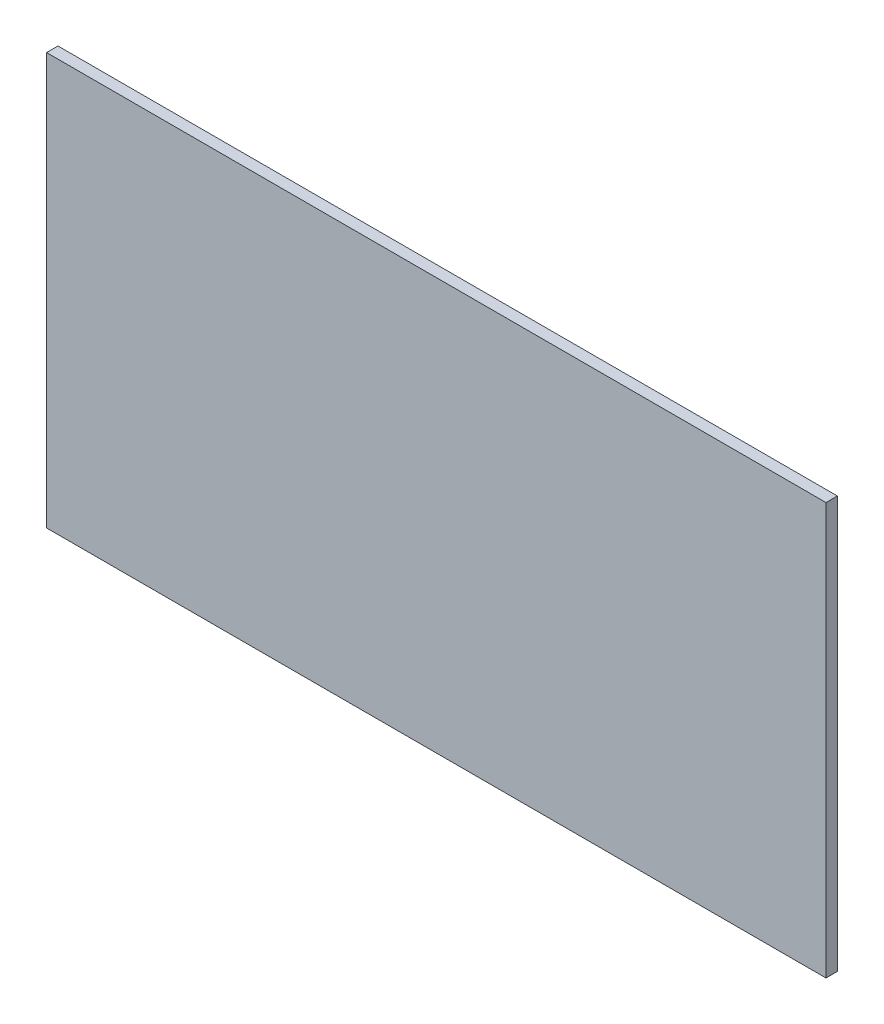
ISO-10303-21;
HEADER;
FILE_DESCRIPTION(('STEP AP214'),'2;1');
FILE_NAME('part.step','',(''),(''),'','','');
FILE_SCHEMA(('AUTOMOTIVE_DESIGN { 1 0 10303 214 1 1 1 1 }'));
ENDSEC;
DATA;
#1=APPLICATION_CONTEXT('core data for automotive mechanical design processes');
#2=APPLICATION_PROTOCOL_DEFINITION('international standard','automotive_design',2000,#1);
#3=PRODUCT_CONTEXT('',#1,'mechanical');
#4=PRODUCT('Part','Part','',(#3));
#5=PRODUCT_RELATED_PRODUCT_CATEGORY('part','',(#4));
#6=PRODUCT_DEFINITION_FORMATION('','',#4);
#7=PRODUCT_DEFINITION_CONTEXT('part definition',#1,'design');
#8=PRODUCT_DEFINITION('design','',#6,#7);
#9=PRODUCT_DEFINITION_SHAPE('','',#8);
#10=(LENGTH_UNIT() NAMED_UNIT(*) SI_UNIT(.MILLI.,.METRE.));
#11=(NAMED_UNIT(*) PLANE_ANGLE_UNIT() SI_UNIT($,.RADIAN.));
#12=(NAMED_UNIT(*) SI_UNIT($,.STERADIAN.) SOLID_ANGLE_UNIT());
#13=UNCERTAINTY_MEASURE_WITH_UNIT(LENGTH_MEASURE(1.E-05),#10,'distance_accuracy_value','');
#14=(GEOMETRIC_REPRESENTATION_CONTEXT(3) GLOBAL_UNCERTAINTY_ASSIGNED_CONTEXT((#13)) GLOBAL_UNIT_ASSIGNED_CONTEXT((#10,
#11,#12)) REPRESENTATION_CONTEXT('',''));
#15=CARTESIAN_POINT('',(0.,0.,0.));
#16=DIRECTION('',(0.,0.,1.));
#17=DIRECTION('',(1.,0.,0.));
#18=AXIS2_PLACEMENT_3D('',#15,#16,#17);
#19=CARTESIAN_POINT('',(0.,0.,1.55));
#20=DIRECTION('',(1.,0.,0.));
#21=DIRECTION('',(0.,0.,-1.));
#22=AXIS2_PLACEMENT_3D('',#19,#20,#21);
#23=PLANE('',#22);
#24=DIRECTION('',(0.,-1.,0.));
#25=VECTOR('',#24,1.);
#26=CARTESIAN_POINT('',(0.,0.,0.));
#27=LINE('',#26,#25);
#28=CARTESIAN_POINT('',(0.,56.,0.));
#29=VERTEX_POINT('',#28);
#30=CARTESIAN_POINT('',(0.,0.,0.));
#31=VERTEX_POINT('',#30);
#32=EDGE_CURVE('E95',#29,#31,#27,.T.);
#33=ORIENTED_EDGE('',*,*,#32,.T.);
#34=DIRECTION('',(0.,0.,-1.));
#35=VECTOR('',#34,1.);
#36=CARTESIAN_POINT('',(0.,0.,1.55));
#37=LINE('',#36,#35);
#38=CARTESIAN_POINT('',(0.,0.,1.55));
#39=VERTEX_POINT('',#38);
#40=EDGE_CURVE('E11',#39,#31,#37,.T.);
#41=ORIENTED_EDGE('',*,*,#40,.F.);
#42=DIRECTION('',(0.,-1.,0.));
#43=VECTOR('',#42,1.);
#44=CARTESIAN_POINT('',(0.,0.,1.55));
#45=LINE('',#44,#43);
#46=CARTESIAN_POINT('',(0.,56.,1.55));
#47=VERTEX_POINT('',#46);
#48=EDGE_CURVE('E83',#47,#39,#45,.T.);
#49=ORIENTED_EDGE('',*,*,#48,.F.);
#50=DIRECTION('',(0.,0.,-1.));
#51=VECTOR('',#50,1.);
#52=CARTESIAN_POINT('',(0.,56.,1.55));
#53=LINE('',#52,#51);
#54=EDGE_CURVE('E91',#47,#29,#53,.T.);
#55=ORIENTED_EDGE('',*,*,#54,.T.);
#56=EDGE_LOOP('',(#33,#41,#49,#55));
#57=FACE_BOUND('',#56,.T.);
#58=ADVANCED_FACE('F32',(#57),#23,.F.);
#59=CARTESIAN_POINT('',(0.,0.,1.55));
#60=DIRECTION('',(0.,1.,0.));
#61=DIRECTION('',(0.,0.,1.));
#62=AXIS2_PLACEMENT_3D('',#59,#60,#61);
#63=PLANE('',#62);
#64=DIRECTION('',(1.,0.,0.));
#65=VECTOR('',#64,1.);
#66=CARTESIAN_POINT('',(0.,0.,0.));
#67=LINE('',#66,#65);
#68=CARTESIAN_POINT('',(106.,0.,0.));
#69=VERTEX_POINT('',#68);
#70=EDGE_CURVE('E87',#31,#69,#67,.T.);
#71=ORIENTED_EDGE('',*,*,#70,.T.);
#72=DIRECTION('',(0.,0.,-1.));
#73=VECTOR('',#72,1.);
#74=CARTESIAN_POINT('',(106.,0.,1.55));
#75=LINE('',#74,#73);
#76=CARTESIAN_POINT('',(106.,0.,1.55));
#77=VERTEX_POINT('',#76);
#78=EDGE_CURVE('E40',#77,#69,#75,.T.);
#79=ORIENTED_EDGE('',*,*,#78,.F.);
#80=DIRECTION('',(1.,0.,0.));
#81=VECTOR('',#80,1.);
#82=CARTESIAN_POINT('',(0.,0.,1.55));
#83=LINE('',#82,#81);
#84=EDGE_CURVE('E78',#39,#77,#83,.T.);
#85=ORIENTED_EDGE('',*,*,#84,.F.);
#86=ORIENTED_EDGE('',*,*,#40,.T.);
#87=EDGE_LOOP('',(#71,#79,#85,#86));
#88=FACE_BOUND('',#87,.T.);
#89=ADVANCED_FACE('F86',(#88),#63,.F.);
#90=CARTESIAN_POINT('',(106.,0.,1.55));
#91=DIRECTION('',(-1.,0.,0.));
#92=DIRECTION('',(0.,0.,1.));
#93=AXIS2_PLACEMENT_3D('',#90,#91,#92);
#94=PLANE('',#93);
#95=DIRECTION('',(0.,1.,0.));
#96=VECTOR('',#95,1.);
#97=CARTESIAN_POINT('',(106.,0.,0.));
#98=LINE('',#97,#96);
#99=CARTESIAN_POINT('',(106.,56.,0.));
#100=VERTEX_POINT('',#99);
#101=EDGE_CURVE('E65',#69,#100,#98,.T.);
#102=ORIENTED_EDGE('',*,*,#101,.T.);
#103=DIRECTION('',(0.,0.,-1.));
#104=VECTOR('',#103,1.);
#105=CARTESIAN_POINT('',(106.,56.,1.55));
#106=LINE('',#105,#104);
#107=CARTESIAN_POINT('',(106.,56.,1.55));
#108=VERTEX_POINT('',#107);
#109=EDGE_CURVE('E88',#108,#100,#106,.T.);
#110=ORIENTED_EDGE('',*,*,#109,.F.);
#111=DIRECTION('',(0.,1.,0.));
#112=VECTOR('',#111,1.);
#113=CARTESIAN_POINT('',(106.,0.,1.55));
#114=LINE('',#113,#112);
#115=EDGE_CURVE('E81',#77,#108,#114,.T.);
#116=ORIENTED_EDGE('',*,*,#115,.F.);
#117=ORIENTED_EDGE('',*,*,#78,.T.);
#118=EDGE_LOOP('',(#102,#110,#116,#117));
#119=FACE_BOUND('',#118,.T.);
#120=ADVANCED_FACE('F89',(#119),#94,.F.);
#121=CARTESIAN_POINT('',(0.,56.,1.55));
#122=DIRECTION('',(0.,-1.,0.));
#123=DIRECTION('',(0.,0.,-1.));
#124=AXIS2_PLACEMENT_3D('',#121,#122,#123);
#125=PLANE('',#124);
#126=DIRECTION('',(-1.,0.,0.));
#127=VECTOR('',#126,1.);
#128=CARTESIAN_POINT('',(0.,56.,0.));
#129=LINE('',#128,#127);
#130=EDGE_CURVE('E71',#100,#29,#129,.T.);
#131=ORIENTED_EDGE('',*,*,#130,.T.);
#132=ORIENTED_EDGE('',*,*,#54,.F.);
#133=DIRECTION('',(-1.,0.,0.));
#134=VECTOR('',#133,1.);
#135=CARTESIAN_POINT('',(0.,56.,1.55));
#136=LINE('',#135,#134);
#137=EDGE_CURVE('E48',#108,#47,#136,.T.);
#138=ORIENTED_EDGE('',*,*,#137,.F.);
#139=ORIENTED_EDGE('',*,*,#109,.T.);
#140=EDGE_LOOP('',(#131,#132,#138,#139));
#141=FACE_BOUND('',#140,.T.);
#142=ADVANCED_FACE('F102',(#141),#125,.F.);
#143=CARTESIAN_POINT('',(0.,0.,1.55));
#144=DIRECTION('',(0.,0.,-1.));
#145=DIRECTION('',(-1.,0.,0.));
#146=AXIS2_PLACEMENT_3D('',#143,#144,#145);
#147=PLANE('',#146);
#148=ORIENTED_EDGE('',*,*,#48,.T.);
#149=ORIENTED_EDGE('',*,*,#84,.T.);
#150=ORIENTED_EDGE('',*,*,#115,.T.);
#151=ORIENTED_EDGE('',*,*,#137,.T.);
#152=EDGE_LOOP('',(#148,#149,#150,#151));
#153=FACE_BOUND('',#152,.T.);
#154=ADVANCED_FACE('F79',(#153),#147,.F.);
#155=CARTESIAN_POINT('',(0.,0.,0.));
#156=DIRECTION('',(0.,0.,-1.));
#157=DIRECTION('',(-1.,0.,0.));
#158=AXIS2_PLACEMENT_3D('',#155,#156,#157);
#159=PLANE('',#158);
#160=ORIENTED_EDGE('',*,*,#32,.F.);
#161=ORIENTED_EDGE('',*,*,#130,.F.);
#162=ORIENTED_EDGE('',*,*,#101,.F.);
#163=ORIENTED_EDGE('',*,*,#70,.F.);
#164=EDGE_LOOP('',(#160,#161,#162,#163));
#165=FACE_BOUND('',#164,.T.);
#166=ADVANCED_FACE('F105',(#165),#159,.T.);
#167=CLOSED_SHELL('',(#58,#89,#120,#142,#154,#166));
#168=MANIFOLD_SOLID_BREP('B2',#167);
#169=ADVANCED_BREP_SHAPE_REPRESENTATION('',(#18,#168),#14);
#170=SHAPE_DEFINITION_REPRESENTATION(#9,#169);
ENDSEC;
END-ISO-10303-21;
